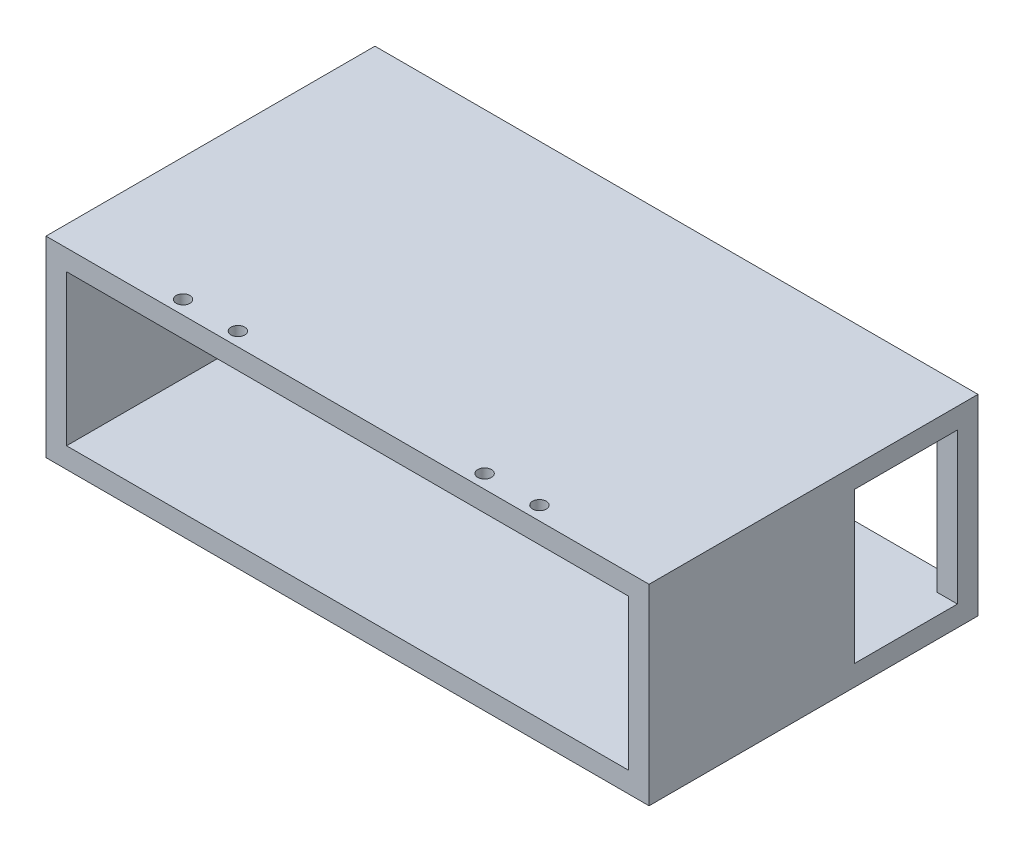
ISO-10303-21;
HEADER;
FILE_DESCRIPTION(('STEP AP214'),'2;1');
FILE_NAME('part.step','',(''),(''),'','','');
FILE_SCHEMA(('AUTOMOTIVE_DESIGN { 1 0 10303 214 1 1 1 1 }'));
ENDSEC;
DATA;
#1=APPLICATION_CONTEXT('core data for automotive mechanical design processes');
#2=APPLICATION_PROTOCOL_DEFINITION('international standard','automotive_design',2000,#1);
#3=PRODUCT_CONTEXT('',#1,'mechanical');
#4=PRODUCT('Part','Part','',(#3));
#5=PRODUCT_RELATED_PRODUCT_CATEGORY('part','',(#4));
#6=PRODUCT_DEFINITION_FORMATION('','',#4);
#7=PRODUCT_DEFINITION_CONTEXT('part definition',#1,'design');
#8=PRODUCT_DEFINITION('design','',#6,#7);
#9=PRODUCT_DEFINITION_SHAPE('','',#8);
#10=(LENGTH_UNIT() NAMED_UNIT(*) SI_UNIT(.MILLI.,.METRE.));
#11=(NAMED_UNIT(*) PLANE_ANGLE_UNIT() SI_UNIT($,.RADIAN.));
#12=(NAMED_UNIT(*) SI_UNIT($,.STERADIAN.) SOLID_ANGLE_UNIT());
#13=UNCERTAINTY_MEASURE_WITH_UNIT(LENGTH_MEASURE(1.E-05),#10,'distance_accuracy_value','');
#14=(GEOMETRIC_REPRESENTATION_CONTEXT(3) GLOBAL_UNCERTAINTY_ASSIGNED_CONTEXT((#13)) GLOBAL_UNIT_ASSIGNED_CONTEXT((#10,
#11,#12)) REPRESENTATION_CONTEXT('',''));
#15=CARTESIAN_POINT('',(0.,0.,0.));
#16=DIRECTION('',(0.,0.,1.));
#17=DIRECTION('',(1.,0.,0.));
#18=AXIS2_PLACEMENT_3D('',#15,#16,#17);
#19=CARTESIAN_POINT('',(0.,0.,3.));
#20=DIRECTION('',(0.,0.,1.));
#21=DIRECTION('',(1.,0.,0.));
#22=AXIS2_PLACEMENT_3D('',#19,#20,#21);
#23=PLANE('',#22);
#24=DIRECTION('',(0.,1.,0.));
#25=VECTOR('',#24,1.);
#26=CARTESIAN_POINT('',(-39.6748376601907,0.,3.));
#27=LINE('',#26,#25);
#28=CARTESIAN_POINT('',(-39.6748376601907,10.7153614457831,3.));
#29=VERTEX_POINT('',#28);
#30=CARTESIAN_POINT('',(-39.6748376601907,32.7153614457831,3.));
#31=VERTEX_POINT('',#30);
#32=EDGE_CURVE('E11',#29,#31,#27,.T.);
#33=ORIENTED_EDGE('',*,*,#32,.F.);
#34=DIRECTION('',(1.,0.,0.));
#35=VECTOR('',#34,1.);
#36=CARTESIAN_POINT('',(-57.6748376601907,10.7153614457831,3.));
#37=LINE('',#36,#35);
#38=CARTESIAN_POINT('',(12.3251623398093,10.7153614457831,3.));
#39=VERTEX_POINT('',#38);
#40=EDGE_CURVE('E288',#29,#39,#37,.T.);
#41=ORIENTED_EDGE('',*,*,#40,.T.);
#42=DIRECTION('',(0.,-1.,0.));
#43=VECTOR('',#42,1.);
#44=CARTESIAN_POINT('',(12.3251623398093,0.,3.));
#45=LINE('',#44,#43);
#46=CARTESIAN_POINT('',(12.3251623398093,32.7153614457831,3.));
#47=VERTEX_POINT('',#46);
#48=EDGE_CURVE('E334',#47,#39,#45,.T.);
#49=ORIENTED_EDGE('',*,*,#48,.F.);
#50=DIRECTION('',(-1.,0.,0.));
#51=VECTOR('',#50,1.);
#52=CARTESIAN_POINT('',(-57.6748376601907,32.7153614457831,3.));
#53=LINE('',#52,#51);
#54=EDGE_CURVE('E297',#47,#31,#53,.T.);
#55=ORIENTED_EDGE('',*,*,#54,.T.);
#56=EDGE_LOOP('',(#33,#41,#49,#55));
#57=FACE_BOUND('',#56,.T.);
#58=ADVANCED_FACE('F32',(#57),#23,.T.);
#59=DIRECTION('',(0.,1.,0.));
#60=VECTOR('',#59,1.);
#61=CARTESIAN_POINT('',(27.3251623398093,0.,3.));
#62=LINE('',#61,#60);
#63=CARTESIAN_POINT('',(27.3251623398093,10.7153614457831,3.));
#64=VERTEX_POINT('',#63);
#65=CARTESIAN_POINT('',(27.3251623398093,32.7153614457831,3.));
#66=VERTEX_POINT('',#65);
#67=EDGE_CURVE('E337',#64,#66,#62,.T.);
#68=ORIENTED_EDGE('',*,*,#67,.F.);
#69=CARTESIAN_POINT('',(30.3251623398093,10.7153614457832,3.));
#70=VERTEX_POINT('',#69);
#71=EDGE_CURVE('E272',#64,#70,#37,.T.);
#72=ORIENTED_EDGE('',*,*,#71,.T.);
#73=DIRECTION('',(0.,-1.,0.));
#74=VECTOR('',#73,1.);
#75=CARTESIAN_POINT('',(30.3251623398093,32.7153614457832,3.));
#76=LINE('',#75,#74);
#77=CARTESIAN_POINT('',(30.3251623398093,32.7153614457832,3.));
#78=VERTEX_POINT('',#77);
#79=EDGE_CURVE('E215',#78,#70,#76,.T.);
#80=ORIENTED_EDGE('',*,*,#79,.F.);
#81=EDGE_CURVE('E293',#78,#66,#53,.T.);
#82=ORIENTED_EDGE('',*,*,#81,.T.);
#83=EDGE_LOOP('',(#68,#72,#80,#82));
#84=FACE_BOUND('',#83,.T.);
#85=ADVANCED_FACE('F352',(#84),#23,.T.);
#86=CARTESIAN_POINT('',(-57.6748376601907,35.7153614457831,48.));
#87=DIRECTION('',(1.,0.,0.));
#88=DIRECTION('',(0.,1.,0.));
#89=AXIS2_PLACEMENT_3D('',#86,#87,#88);
#90=PLANE('',#89);
#91=DIRECTION('',(0.,0.,1.));
#92=VECTOR('',#91,1.);
#93=CARTESIAN_POINT('',(-57.6748376601907,10.7153614457831,3.));
#94=LINE('',#93,#92);
#95=CARTESIAN_POINT('',(-57.6748376601907,10.7153614457831,3.));
#96=VERTEX_POINT('',#95);
#97=CARTESIAN_POINT('',(-57.6748376601907,10.7153614457831,18.));
#98=VERTEX_POINT('',#97);
#99=EDGE_CURVE('E231',#96,#98,#94,.T.);
#100=ORIENTED_EDGE('',*,*,#99,.F.);
#101=DIRECTION('',(0.,-1.,0.));
#102=VECTOR('',#101,1.);
#103=CARTESIAN_POINT('',(-57.6748376601907,32.7153614457831,3.));
#104=LINE('',#103,#102);
#105=CARTESIAN_POINT('',(-57.6748376601907,32.7153614457831,3.));
#106=VERTEX_POINT('',#105);
#107=EDGE_CURVE('E208',#106,#96,#104,.T.);
#108=ORIENTED_EDGE('',*,*,#107,.F.);
#109=DIRECTION('',(0.,0.,-1.));
#110=VECTOR('',#109,1.);
#111=CARTESIAN_POINT('',(-57.6748376601907,32.7153614457831,3.));
#112=LINE('',#111,#110);
#113=CARTESIAN_POINT('',(-57.6748376601907,32.7153614457831,18.));
#114=VERTEX_POINT('',#113);
#115=EDGE_CURVE('E219',#114,#106,#112,.T.);
#116=ORIENTED_EDGE('',*,*,#115,.F.);
#117=DIRECTION('',(0.,1.,0.));
#118=VECTOR('',#117,1.);
#119=CARTESIAN_POINT('',(-57.6748376601907,32.7153614457831,18.));
#120=LINE('',#119,#118);
#121=EDGE_CURVE('E234',#98,#114,#120,.T.);
#122=ORIENTED_EDGE('',*,*,#121,.F.);
#123=EDGE_LOOP('',(#100,#108,#116,#122));
#124=FACE_BOUND('',#123,.T.);
#125=DIRECTION('',(0.,-1.,0.));
#126=VECTOR('',#125,1.);
#127=CARTESIAN_POINT('',(-57.6748376601907,35.7153614457831,0.));
#128=LINE('',#127,#126);
#129=CARTESIAN_POINT('',(-57.6748376601907,35.7153614457831,0.));
#130=VERTEX_POINT('',#129);
#131=CARTESIAN_POINT('',(-57.6748376601907,7.71536144578314,0.));
#132=VERTEX_POINT('',#131);
#133=EDGE_CURVE('E278',#130,#132,#128,.T.);
#134=ORIENTED_EDGE('',*,*,#133,.T.);
#135=DIRECTION('',(0.,0.,-1.));
#136=VECTOR('',#135,1.);
#137=CARTESIAN_POINT('',(-57.6748376601907,7.71536144578314,48.));
#138=LINE('',#137,#136);
#139=CARTESIAN_POINT('',(-57.6748376601907,7.71536144578314,48.));
#140=VERTEX_POINT('',#139);
#141=EDGE_CURVE('E331',#140,#132,#138,.T.);
#142=ORIENTED_EDGE('',*,*,#141,.F.);
#143=DIRECTION('',(0.,-1.,0.));
#144=VECTOR('',#143,1.);
#145=CARTESIAN_POINT('',(-57.6748376601907,35.7153614457831,48.));
#146=LINE('',#145,#144);
#147=CARTESIAN_POINT('',(-57.6748376601907,35.7153614457831,48.));
#148=VERTEX_POINT('',#147);
#149=EDGE_CURVE('E305',#148,#140,#146,.T.);
#150=ORIENTED_EDGE('',*,*,#149,.F.);
#151=DIRECTION('',(0.,0.,-1.));
#152=VECTOR('',#151,1.);
#153=CARTESIAN_POINT('',(-57.6748376601907,35.7153614457831,48.));
#154=LINE('',#153,#152);
#155=EDGE_CURVE('E315',#148,#130,#154,.T.);
#156=ORIENTED_EDGE('',*,*,#155,.T.);
#157=EDGE_LOOP('',(#134,#142,#150,#156));
#158=FACE_BOUND('',#157,.T.);
#159=ADVANCED_FACE('F34',(#124,#158),#90,.F.);
#160=CARTESIAN_POINT('',(-57.6748376601907,7.71536144578314,48.));
#161=DIRECTION('',(0.,1.,0.));
#162=DIRECTION('',(0.,0.,1.));
#163=AXIS2_PLACEMENT_3D('',#160,#161,#162);
#164=PLANE('',#163);
#165=DIRECTION('',(1.,0.,0.));
#166=VECTOR('',#165,1.);
#167=CARTESIAN_POINT('',(-57.6748376601907,7.71536144578314,0.));
#168=LINE('',#167,#166);
#169=CARTESIAN_POINT('',(30.3251623398093,7.71536144578314,0.));
#170=VERTEX_POINT('',#169);
#171=EDGE_CURVE('E318',#132,#170,#168,.T.);
#172=ORIENTED_EDGE('',*,*,#171,.T.);
#173=DIRECTION('',(0.,0.,-1.));
#174=VECTOR('',#173,1.);
#175=CARTESIAN_POINT('',(30.3251623398093,7.71536144578314,48.));
#176=LINE('',#175,#174);
#177=CARTESIAN_POINT('',(30.3251623398093,7.71536144578314,48.));
#178=VERTEX_POINT('',#177);
#179=EDGE_CURVE('E328',#178,#170,#176,.T.);
#180=ORIENTED_EDGE('',*,*,#179,.F.);
#181=DIRECTION('',(1.,0.,0.));
#182=VECTOR('',#181,1.);
#183=CARTESIAN_POINT('',(-57.6748376601907,7.71536144578314,48.));
#184=LINE('',#183,#182);
#185=EDGE_CURVE('E308',#140,#178,#184,.T.);
#186=ORIENTED_EDGE('',*,*,#185,.F.);
#187=ORIENTED_EDGE('',*,*,#141,.T.);
#188=EDGE_LOOP('',(#172,#180,#186,#187));
#189=FACE_BOUND('',#188,.T.);
#190=ADVANCED_FACE('F495',(#189),#164,.F.);
#191=CARTESIAN_POINT('',(30.3251623398093,35.7153614457831,48.));
#192=DIRECTION('',(-1.,0.,0.));
#193=DIRECTION('',(0.,-1.,0.));
#194=AXIS2_PLACEMENT_3D('',#191,#192,#193);
#195=PLANE('',#194);
#196=DIRECTION('',(0.,0.,-1.));
#197=VECTOR('',#196,1.);
#198=CARTESIAN_POINT('',(30.3251623398093,32.7153614457832,3.));
#199=LINE('',#198,#197);
#200=CARTESIAN_POINT('',(30.3251623398093,32.7153614457832,18.));
#201=VERTEX_POINT('',#200);
#202=EDGE_CURVE('E225',#201,#78,#199,.T.);
#203=ORIENTED_EDGE('',*,*,#202,.T.);
#204=ORIENTED_EDGE('',*,*,#79,.T.);
#205=DIRECTION('',(0.,0.,1.));
#206=VECTOR('',#205,1.);
#207=CARTESIAN_POINT('',(30.3251623398093,10.7153614457832,3.));
#208=LINE('',#207,#206);
#209=CARTESIAN_POINT('',(30.3251623398093,10.7153614457832,18.));
#210=VERTEX_POINT('',#209);
#211=EDGE_CURVE('E218',#70,#210,#208,.T.);
#212=ORIENTED_EDGE('',*,*,#211,.T.);
#213=DIRECTION('',(0.,1.,0.));
#214=VECTOR('',#213,1.);
#215=CARTESIAN_POINT('',(30.3251623398093,32.7153614457832,18.));
#216=LINE('',#215,#214);
#217=EDGE_CURVE('E222',#210,#201,#216,.T.);
#218=ORIENTED_EDGE('',*,*,#217,.T.);
#219=EDGE_LOOP('',(#203,#204,#212,#218));
#220=FACE_BOUND('',#219,.T.);
#221=DIRECTION('',(0.,1.,0.));
#222=VECTOR('',#221,1.);
#223=CARTESIAN_POINT('',(30.3251623398093,35.7153614457831,0.));
#224=LINE('',#223,#222);
#225=CARTESIAN_POINT('',(30.3251623398093,35.7153614457831,0.));
#226=VERTEX_POINT('',#225);
#227=EDGE_CURVE('E320',#170,#226,#224,.T.);
#228=ORIENTED_EDGE('',*,*,#227,.T.);
#229=DIRECTION('',(0.,0.,-1.));
#230=VECTOR('',#229,1.);
#231=CARTESIAN_POINT('',(30.3251623398093,35.7153614457831,48.));
#232=LINE('',#231,#230);
#233=CARTESIAN_POINT('',(30.3251623398093,35.7153614457831,48.));
#234=VERTEX_POINT('',#233);
#235=EDGE_CURVE('E325',#234,#226,#232,.T.);
#236=ORIENTED_EDGE('',*,*,#235,.F.);
#237=DIRECTION('',(0.,1.,0.));
#238=VECTOR('',#237,1.);
#239=CARTESIAN_POINT('',(30.3251623398093,35.7153614457831,48.));
#240=LINE('',#239,#238);
#241=EDGE_CURVE('E311',#178,#234,#240,.T.);
#242=ORIENTED_EDGE('',*,*,#241,.F.);
#243=ORIENTED_EDGE('',*,*,#179,.T.);
#244=EDGE_LOOP('',(#228,#236,#242,#243));
#245=FACE_BOUND('',#244,.T.);
#246=ADVANCED_FACE('F355',(#220,#245),#195,.F.);
#247=CARTESIAN_POINT('',(-57.6748376601907,35.7153614457831,48.));
#248=DIRECTION('',(0.,-1.,0.));
#249=DIRECTION('',(0.,0.,-1.));
#250=AXIS2_PLACEMENT_3D('',#247,#248,#249);
#251=PLANE('',#250);
#252=CARTESIAN_POINT('',(-39.6748376601907,35.7153614457831,46.));
#253=DIRECTION('',(0.,1.,0.));
#254=DIRECTION('',(0.,0.,1.));
#255=AXIS2_PLACEMENT_3D('',#252,#253,#254);
#256=CIRCLE('',#255,0.999999999999998);
#257=CARTESIAN_POINT('',(-39.6748376601907,35.7153614457831,47.));
#258=VERTEX_POINT('',#257);
#259=EDGE_CURVE('E255',#258,#258,#256,.T.);
#260=ORIENTED_EDGE('',*,*,#259,.F.);
#261=EDGE_LOOP('',(#260));
#262=FACE_BOUND('',#261,.T.);
#263=CARTESIAN_POINT('',(12.3251623398093,35.7153614457831,46.));
#264=DIRECTION('',(0.,1.,0.));
#265=DIRECTION('',(0.,0.,-1.));
#266=AXIS2_PLACEMENT_3D('',#263,#264,#265);
#267=CIRCLE('',#266,0.999999999999998);
#268=CARTESIAN_POINT('',(12.3251623398093,35.7153614457831,45.));
#269=VERTEX_POINT('',#268);
#270=EDGE_CURVE('E261',#269,#269,#267,.T.);
#271=ORIENTED_EDGE('',*,*,#270,.F.);
#272=EDGE_LOOP('',(#271));
#273=FACE_BOUND('',#272,.T.);
#274=CARTESIAN_POINT('',(4.32516233980931,35.7153614457831,46.));
#275=DIRECTION('',(0.,1.,0.));
#276=DIRECTION('',(0.,0.,-1.));
#277=AXIS2_PLACEMENT_3D('',#274,#275,#276);
#278=CIRCLE('',#277,1.);
#279=CARTESIAN_POINT('',(4.32516233980931,35.7153614457831,45.));
#280=VERTEX_POINT('',#279);
#281=EDGE_CURVE('E250',#280,#280,#278,.T.);
#282=ORIENTED_EDGE('',*,*,#281,.F.);
#283=EDGE_LOOP('',(#282));
#284=FACE_BOUND('',#283,.T.);
#285=CARTESIAN_POINT('',(-31.6748376601907,35.7153614457831,46.));
#286=DIRECTION('',(0.,1.,0.));
#287=DIRECTION('',(0.,0.,1.));
#288=AXIS2_PLACEMENT_3D('',#285,#286,#287);
#289=CIRCLE('',#288,1.);
#290=CARTESIAN_POINT('',(-31.6748376601907,35.7153614457831,47.));
#291=VERTEX_POINT('',#290);
#292=EDGE_CURVE('E254',#291,#291,#289,.T.);
#293=ORIENTED_EDGE('',*,*,#292,.F.);
#294=EDGE_LOOP('',(#293));
#295=FACE_BOUND('',#294,.T.);
#296=DIRECTION('',(-1.,0.,0.));
#297=VECTOR('',#296,1.);
#298=CARTESIAN_POINT('',(-57.6748376601907,35.7153614457831,0.));
#299=LINE('',#298,#297);
#300=EDGE_CURVE('E309',#226,#130,#299,.T.);
#301=ORIENTED_EDGE('',*,*,#300,.T.);
#302=ORIENTED_EDGE('',*,*,#155,.F.);
#303=DIRECTION('',(-1.,0.,0.));
#304=VECTOR('',#303,1.);
#305=CARTESIAN_POINT('',(-57.6748376601907,35.7153614457831,48.));
#306=LINE('',#305,#304);
#307=EDGE_CURVE('E313',#234,#148,#306,.T.);
#308=ORIENTED_EDGE('',*,*,#307,.F.);
#309=ORIENTED_EDGE('',*,*,#235,.T.);
#310=EDGE_LOOP('',(#301,#302,#308,#309));
#311=FACE_BOUND('',#310,.T.);
#312=ADVANCED_FACE('F474',(#262,#273,#284,#295,#311),#251,.F.);
#313=CARTESIAN_POINT('',(0.,0.,48.));
#314=DIRECTION('',(0.,0.,1.));
#315=DIRECTION('',(1.,0.,0.));
#316=AXIS2_PLACEMENT_3D('',#313,#314,#315);
#317=PLANE('',#316);
#318=DIRECTION('',(0.,-1.,0.));
#319=VECTOR('',#318,1.);
#320=CARTESIAN_POINT('',(-54.6748376601907,35.7153614457831,48.));
#321=LINE('',#320,#319);
#322=CARTESIAN_POINT('',(-54.6748376601907,32.7153614457831,48.));
#323=VERTEX_POINT('',#322);
#324=CARTESIAN_POINT('',(-54.6748376601907,10.7153614457831,48.));
#325=VERTEX_POINT('',#324);
#326=EDGE_CURVE('E296',#323,#325,#321,.T.);
#327=ORIENTED_EDGE('',*,*,#326,.F.);
#328=DIRECTION('',(-1.,0.,0.));
#329=VECTOR('',#328,1.);
#330=CARTESIAN_POINT('',(-57.6748376601907,32.7153614457831,48.));
#331=LINE('',#330,#329);
#332=CARTESIAN_POINT('',(27.3251623398093,32.7153614457831,48.));
#333=VERTEX_POINT('',#332);
#334=EDGE_CURVE('E284',#333,#323,#331,.T.);
#335=ORIENTED_EDGE('',*,*,#334,.F.);
#336=DIRECTION('',(0.,1.,0.));
#337=VECTOR('',#336,1.);
#338=CARTESIAN_POINT('',(27.3251623398093,35.7153614457831,48.));
#339=LINE('',#338,#337);
#340=CARTESIAN_POINT('',(27.3251623398093,10.7153614457831,48.));
#341=VERTEX_POINT('',#340);
#342=EDGE_CURVE('E301',#341,#333,#339,.T.);
#343=ORIENTED_EDGE('',*,*,#342,.F.);
#344=DIRECTION('',(1.,0.,0.));
#345=VECTOR('',#344,1.);
#346=CARTESIAN_POINT('',(-57.6748376601907,10.7153614457831,48.));
#347=LINE('',#346,#345);
#348=EDGE_CURVE('E299',#325,#341,#347,.T.);
#349=ORIENTED_EDGE('',*,*,#348,.F.);
#350=EDGE_LOOP('',(#327,#335,#343,#349));
#351=FACE_BOUND('',#350,.T.);
#352=ORIENTED_EDGE('',*,*,#149,.T.);
#353=ORIENTED_EDGE('',*,*,#185,.T.);
#354=ORIENTED_EDGE('',*,*,#241,.T.);
#355=ORIENTED_EDGE('',*,*,#307,.T.);
#356=EDGE_LOOP('',(#352,#353,#354,#355));
#357=FACE_BOUND('',#356,.T.);
#358=ADVANCED_FACE('F367',(#351,#357),#317,.T.);
#359=CARTESIAN_POINT('',(0.,0.,0.));
#360=DIRECTION('',(0.,0.,1.));
#361=DIRECTION('',(1.,0.,0.));
#362=AXIS2_PLACEMENT_3D('',#359,#360,#361);
#363=PLANE('',#362);
#364=DIRECTION('',(-1.,0.,0.));
#365=VECTOR('',#364,1.);
#366=CARTESIAN_POINT('',(-39.6748376601907,10.7153614457831,0.));
#367=LINE('',#366,#365);
#368=CARTESIAN_POINT('',(-39.6748376601907,10.7153614457831,0.));
#369=VERTEX_POINT('',#368);
#370=CARTESIAN_POINT('',(-54.6748376601907,10.7153614457831,0.));
#371=VERTEX_POINT('',#370);
#372=EDGE_CURVE('E177',#369,#371,#367,.T.);
#373=ORIENTED_EDGE('',*,*,#372,.F.);
#374=DIRECTION('',(0.,-1.,0.));
#375=VECTOR('',#374,1.);
#376=CARTESIAN_POINT('',(-39.6748376601907,32.7153614457831,0.));
#377=LINE('',#376,#375);
#378=CARTESIAN_POINT('',(-39.6748376601907,32.7153614457831,0.));
#379=VERTEX_POINT('',#378);
#380=EDGE_CURVE('E47',#379,#369,#377,.T.);
#381=ORIENTED_EDGE('',*,*,#380,.F.);
#382=DIRECTION('',(1.,0.,0.));
#383=VECTOR('',#382,1.);
#384=CARTESIAN_POINT('',(-39.6748376601907,32.7153614457831,0.));
#385=LINE('',#384,#383);
#386=CARTESIAN_POINT('',(-54.6748376601907,32.7153614457831,0.));
#387=VERTEX_POINT('',#386);
#388=EDGE_CURVE('E185',#387,#379,#385,.T.);
#389=ORIENTED_EDGE('',*,*,#388,.F.);
#390=DIRECTION('',(0.,1.,0.));
#391=VECTOR('',#390,1.);
#392=CARTESIAN_POINT('',(-54.6748376601907,32.7153614457831,0.));
#393=LINE('',#392,#391);
#394=EDGE_CURVE('E169',#371,#387,#393,.T.);
#395=ORIENTED_EDGE('',*,*,#394,.F.);
#396=EDGE_LOOP('',(#373,#381,#389,#395));
#397=FACE_BOUND('',#396,.T.);
#398=DIRECTION('',(-1.,0.,0.));
#399=VECTOR('',#398,1.);
#400=CARTESIAN_POINT('',(27.3251623398093,10.7153614457831,0.));
#401=LINE('',#400,#399);
#402=CARTESIAN_POINT('',(27.3251623398093,10.7153614457831,0.));
#403=VERTEX_POINT('',#402);
#404=CARTESIAN_POINT('',(12.3251623398093,10.7153614457831,0.));
#405=VERTEX_POINT('',#404);
#406=EDGE_CURVE('E196',#403,#405,#401,.T.);
#407=ORIENTED_EDGE('',*,*,#406,.F.);
#408=DIRECTION('',(0.,-1.,0.));
#409=VECTOR('',#408,1.);
#410=CARTESIAN_POINT('',(27.3251623398093,32.7153614457831,0.));
#411=LINE('',#410,#409);
#412=CARTESIAN_POINT('',(27.3251623398093,32.7153614457831,0.));
#413=VERTEX_POINT('',#412);
#414=EDGE_CURVE('E192',#413,#403,#411,.T.);
#415=ORIENTED_EDGE('',*,*,#414,.F.);
#416=DIRECTION('',(1.,0.,0.));
#417=VECTOR('',#416,1.);
#418=CARTESIAN_POINT('',(27.3251623398093,32.7153614457831,0.));
#419=LINE('',#418,#417);
#420=CARTESIAN_POINT('',(12.3251623398093,32.7153614457831,0.));
#421=VERTEX_POINT('',#420);
#422=EDGE_CURVE('E202',#421,#413,#419,.T.);
#423=ORIENTED_EDGE('',*,*,#422,.F.);
#424=DIRECTION('',(0.,1.,0.));
#425=VECTOR('',#424,1.);
#426=CARTESIAN_POINT('',(12.3251623398093,32.7153614457831,0.));
#427=LINE('',#426,#425);
#428=EDGE_CURVE('E199',#405,#421,#427,.T.);
#429=ORIENTED_EDGE('',*,*,#428,.F.);
#430=EDGE_LOOP('',(#407,#415,#423,#429));
#431=FACE_BOUND('',#430,.T.);
#432=ORIENTED_EDGE('',*,*,#133,.F.);
#433=ORIENTED_EDGE('',*,*,#300,.F.);
#434=ORIENTED_EDGE('',*,*,#227,.F.);
#435=ORIENTED_EDGE('',*,*,#171,.F.);
#436=EDGE_LOOP('',(#432,#433,#434,#435));
#437=FACE_BOUND('',#436,.T.);
#438=ADVANCED_FACE('F182',(#397,#431,#437),#363,.F.);
#439=CARTESIAN_POINT('',(-54.6748376601907,35.7153614457831,48.));
#440=DIRECTION('',(1.,0.,0.));
#441=DIRECTION('',(0.,1.,0.));
#442=AXIS2_PLACEMENT_3D('',#439,#440,#441);
#443=PLANE('',#442);
#444=DIRECTION('',(0.,-1.,0.));
#445=VECTOR('',#444,1.);
#446=CARTESIAN_POINT('',(-54.6748376601907,35.7153614457831,18.));
#447=LINE('',#446,#445);
#448=CARTESIAN_POINT('',(-54.6748376601907,32.7153614457831,18.));
#449=VERTEX_POINT('',#448);
#450=CARTESIAN_POINT('',(-54.6748376601907,10.7153614457831,18.));
#451=VERTEX_POINT('',#450);
#452=EDGE_CURVE('E247',#449,#451,#447,.T.);
#453=ORIENTED_EDGE('',*,*,#452,.F.);
#454=DIRECTION('',(0.,0.,-1.));
#455=VECTOR('',#454,1.);
#456=CARTESIAN_POINT('',(-54.6748376601907,32.7153614457831,48.));
#457=LINE('',#456,#455);
#458=EDGE_CURVE('E280',#323,#449,#457,.T.);
#459=ORIENTED_EDGE('',*,*,#458,.F.);
#460=ORIENTED_EDGE('',*,*,#326,.T.);
#461=DIRECTION('',(0.,0.,-1.));
#462=VECTOR('',#461,1.);
#463=CARTESIAN_POINT('',(-54.6748376601907,10.7153614457831,48.));
#464=LINE('',#463,#462);
#465=EDGE_CURVE('E275',#325,#451,#464,.T.);
#466=ORIENTED_EDGE('',*,*,#465,.T.);
#467=EDGE_LOOP('',(#453,#459,#460,#466));
#468=FACE_BOUND('',#467,.T.);
#469=ADVANCED_FACE('F372',(#468),#443,.T.);
#470=CARTESIAN_POINT('',(-57.6748376601907,10.7153614457831,48.));
#471=DIRECTION('',(0.,1.,0.));
#472=DIRECTION('',(0.,0.,1.));
#473=AXIS2_PLACEMENT_3D('',#470,#471,#472);
#474=PLANE('',#473);
#475=ORIENTED_EDGE('',*,*,#40,.F.);
#476=DIRECTION('',(0.,0.,-1.));
#477=VECTOR('',#476,1.);
#478=CARTESIAN_POINT('',(-39.6748376601907,10.7153614457831,15.));
#479=LINE('',#478,#477);
#480=EDGE_CURVE('E174',#29,#369,#479,.T.);
#481=ORIENTED_EDGE('',*,*,#480,.T.);
#482=ORIENTED_EDGE('',*,*,#372,.T.);
#483=DIRECTION('',(0.,0.,-1.));
#484=VECTOR('',#483,1.);
#485=CARTESIAN_POINT('',(-54.6748376601907,10.7153614457831,15.));
#486=LINE('',#485,#484);
#487=CARTESIAN_POINT('',(-54.6748376601907,10.7153614457831,3.));
#488=VERTEX_POINT('',#487);
#489=EDGE_CURVE('E55',#488,#371,#486,.T.);
#490=ORIENTED_EDGE('',*,*,#489,.F.);
#491=EDGE_CURVE('E285',#96,#488,#37,.T.);
#492=ORIENTED_EDGE('',*,*,#491,.F.);
#493=ORIENTED_EDGE('',*,*,#99,.T.);
#494=DIRECTION('',(-1.,0.,0.));
#495=VECTOR('',#494,1.);
#496=CARTESIAN_POINT('',(30.3251623398093,10.7153614457832,18.));
#497=LINE('',#496,#495);
#498=EDGE_CURVE('E228',#451,#98,#497,.T.);
#499=ORIENTED_EDGE('',*,*,#498,.F.);
#500=ORIENTED_EDGE('',*,*,#465,.F.);
#501=ORIENTED_EDGE('',*,*,#348,.T.);
#502=DIRECTION('',(0.,0.,-1.));
#503=VECTOR('',#502,1.);
#504=CARTESIAN_POINT('',(27.3251623398093,10.7153614457831,48.));
#505=LINE('',#504,#503);
#506=CARTESIAN_POINT('',(27.3251623398093,10.7153614457832,18.));
#507=VERTEX_POINT('',#506);
#508=EDGE_CURVE('E279',#341,#507,#505,.T.);
#509=ORIENTED_EDGE('',*,*,#508,.T.);
#510=EDGE_CURVE('E244',#210,#507,#497,.T.);
#511=ORIENTED_EDGE('',*,*,#510,.F.);
#512=ORIENTED_EDGE('',*,*,#211,.F.);
#513=ORIENTED_EDGE('',*,*,#71,.F.);
#514=DIRECTION('',(0.,0.,-1.));
#515=VECTOR('',#514,1.);
#516=CARTESIAN_POINT('',(27.3251623398093,10.7153614457831,15.));
#517=LINE('',#516,#515);
#518=EDGE_CURVE('E205',#64,#403,#517,.T.);
#519=ORIENTED_EDGE('',*,*,#518,.T.);
#520=ORIENTED_EDGE('',*,*,#406,.T.);
#521=DIRECTION('',(0.,0.,-1.));
#522=VECTOR('',#521,1.);
#523=CARTESIAN_POINT('',(12.3251623398093,10.7153614457831,15.));
#524=LINE('',#523,#522);
#525=EDGE_CURVE('E211',#39,#405,#524,.T.);
#526=ORIENTED_EDGE('',*,*,#525,.F.);
#527=EDGE_LOOP('',(#475,#481,#482,#490,#492,#493,#499,#500,#501,#509,#511,#512,#513,#519,#520,#526));
#528=FACE_BOUND('',#527,.T.);
#529=ADVANCED_FACE('F179',(#528),#474,.T.);
#530=CARTESIAN_POINT('',(27.3251623398093,35.7153614457831,48.));
#531=DIRECTION('',(-1.,0.,0.));
#532=DIRECTION('',(0.,-1.,0.));
#533=AXIS2_PLACEMENT_3D('',#530,#531,#532);
#534=PLANE('',#533);
#535=DIRECTION('',(0.,1.,0.));
#536=VECTOR('',#535,1.);
#537=CARTESIAN_POINT('',(27.3251623398093,35.7153614457831,18.));
#538=LINE('',#537,#536);
#539=CARTESIAN_POINT('',(27.3251623398093,32.7153614457832,18.));
#540=VERTEX_POINT('',#539);
#541=EDGE_CURVE('E242',#507,#540,#538,.T.);
#542=ORIENTED_EDGE('',*,*,#541,.F.);
#543=ORIENTED_EDGE('',*,*,#508,.F.);
#544=ORIENTED_EDGE('',*,*,#342,.T.);
#545=DIRECTION('',(0.,0.,-1.));
#546=VECTOR('',#545,1.);
#547=CARTESIAN_POINT('',(27.3251623398093,32.7153614457831,48.));
#548=LINE('',#547,#546);
#549=EDGE_CURVE('E283',#333,#540,#548,.T.);
#550=ORIENTED_EDGE('',*,*,#549,.T.);
#551=EDGE_LOOP('',(#542,#543,#544,#550));
#552=FACE_BOUND('',#551,.T.);
#553=ADVANCED_FACE('F360',(#552),#534,.T.);
#554=CARTESIAN_POINT('',(-57.6748376601907,32.7153614457831,48.));
#555=DIRECTION('',(0.,-1.,0.));
#556=DIRECTION('',(0.,0.,-1.));
#557=AXIS2_PLACEMENT_3D('',#554,#555,#556);
#558=PLANE('',#557);
#559=CARTESIAN_POINT('',(-54.6748376601907,32.7153614457831,3.));
#560=VERTEX_POINT('',#559);
#561=EDGE_CURVE('E287',#560,#106,#53,.T.);
#562=ORIENTED_EDGE('',*,*,#561,.F.);
#563=DIRECTION('',(0.,0.,-1.));
#564=VECTOR('',#563,1.);
#565=CARTESIAN_POINT('',(-54.6748376601907,32.7153614457831,15.));
#566=LINE('',#565,#564);
#567=EDGE_CURVE('E173',#560,#387,#566,.T.);
#568=ORIENTED_EDGE('',*,*,#567,.T.);
#569=ORIENTED_EDGE('',*,*,#388,.T.);
#570=DIRECTION('',(0.,0.,-1.));
#571=VECTOR('',#570,1.);
#572=CARTESIAN_POINT('',(-39.6748376601907,32.7153614457831,15.));
#573=LINE('',#572,#571);
#574=EDGE_CURVE('E190',#31,#379,#573,.T.);
#575=ORIENTED_EDGE('',*,*,#574,.F.);
#576=ORIENTED_EDGE('',*,*,#54,.F.);
#577=DIRECTION('',(0.,0.,-1.));
#578=VECTOR('',#577,1.);
#579=CARTESIAN_POINT('',(12.3251623398093,32.7153614457831,15.));
#580=LINE('',#579,#578);
#581=EDGE_CURVE('E209',#47,#421,#580,.T.);
#582=ORIENTED_EDGE('',*,*,#581,.T.);
#583=ORIENTED_EDGE('',*,*,#422,.T.);
#584=DIRECTION('',(0.,0.,-1.));
#585=VECTOR('',#584,1.);
#586=CARTESIAN_POINT('',(27.3251623398093,32.7153614457831,15.));
#587=LINE('',#586,#585);
#588=EDGE_CURVE('E206',#66,#413,#587,.T.);
#589=ORIENTED_EDGE('',*,*,#588,.F.);
#590=ORIENTED_EDGE('',*,*,#81,.F.);
#591=ORIENTED_EDGE('',*,*,#202,.F.);
#592=DIRECTION('',(-1.,0.,0.));
#593=VECTOR('',#592,1.);
#594=CARTESIAN_POINT('',(30.3251623398093,32.7153614457832,18.));
#595=LINE('',#594,#593);
#596=EDGE_CURVE('E239',#201,#540,#595,.T.);
#597=ORIENTED_EDGE('',*,*,#596,.T.);
#598=ORIENTED_EDGE('',*,*,#549,.F.);
#599=ORIENTED_EDGE('',*,*,#334,.T.);
#600=ORIENTED_EDGE('',*,*,#458,.T.);
#601=EDGE_CURVE('E243',#449,#114,#595,.T.);
#602=ORIENTED_EDGE('',*,*,#601,.T.);
#603=ORIENTED_EDGE('',*,*,#115,.T.);
#604=EDGE_LOOP('',(#562,#568,#569,#575,#576,#582,#583,#589,#590,#591,#597,#598,#599,#600,#602,#603));
#605=FACE_BOUND('',#604,.T.);
#606=CARTESIAN_POINT('',(-39.6748376601907,32.7153614457831,46.));
#607=DIRECTION('',(0.,1.,0.));
#608=DIRECTION('',(0.,0.,1.));
#609=AXIS2_PLACEMENT_3D('',#606,#607,#608);
#610=CIRCLE('',#609,0.999999999999998);
#611=CARTESIAN_POINT('',(-39.6748376601907,32.7153614457831,47.));
#612=VERTEX_POINT('',#611);
#613=EDGE_CURVE('E251',#612,#612,#610,.T.);
#614=ORIENTED_EDGE('',*,*,#613,.T.);
#615=EDGE_LOOP('',(#614));
#616=FACE_BOUND('',#615,.T.);
#617=CARTESIAN_POINT('',(12.3251623398093,32.7153614457831,46.));
#618=DIRECTION('',(0.,1.,0.));
#619=DIRECTION('',(0.,0.,-1.));
#620=AXIS2_PLACEMENT_3D('',#617,#618,#619);
#621=CIRCLE('',#620,0.999999999999998);
#622=CARTESIAN_POINT('',(12.3251623398093,32.7153614457831,45.));
#623=VERTEX_POINT('',#622);
#624=EDGE_CURVE('E258',#623,#623,#621,.T.);
#625=ORIENTED_EDGE('',*,*,#624,.T.);
#626=EDGE_LOOP('',(#625));
#627=FACE_BOUND('',#626,.T.);
#628=CARTESIAN_POINT('',(4.32516233980931,32.7153614457831,46.));
#629=DIRECTION('',(0.,1.,0.));
#630=DIRECTION('',(0.,0.,-1.));
#631=AXIS2_PLACEMENT_3D('',#628,#629,#630);
#632=CIRCLE('',#631,1.);
#633=CARTESIAN_POINT('',(4.32516233980931,32.7153614457831,45.));
#634=VERTEX_POINT('',#633);
#635=EDGE_CURVE('E264',#634,#634,#632,.T.);
#636=ORIENTED_EDGE('',*,*,#635,.T.);
#637=EDGE_LOOP('',(#636));
#638=FACE_BOUND('',#637,.T.);
#639=CARTESIAN_POINT('',(-31.6748376601907,32.7153614457831,46.));
#640=DIRECTION('',(0.,1.,0.));
#641=DIRECTION('',(0.,0.,1.));
#642=AXIS2_PLACEMENT_3D('',#639,#640,#641);
#643=CIRCLE('',#642,1.);
#644=CARTESIAN_POINT('',(-31.6748376601907,32.7153614457831,47.));
#645=VERTEX_POINT('',#644);
#646=EDGE_CURVE('E269',#645,#645,#643,.T.);
#647=ORIENTED_EDGE('',*,*,#646,.T.);
#648=EDGE_LOOP('',(#647));
#649=FACE_BOUND('',#648,.T.);
#650=ADVANCED_FACE('F346',(#605,#616,#627,#638,#649),#558,.T.);
#651=DIRECTION('',(0.,-1.,0.));
#652=VECTOR('',#651,1.);
#653=CARTESIAN_POINT('',(-54.6748376601907,0.,3.));
#654=LINE('',#653,#652);
#655=EDGE_CURVE('E40',#560,#488,#654,.T.);
#656=ORIENTED_EDGE('',*,*,#655,.F.);
#657=ORIENTED_EDGE('',*,*,#561,.T.);
#658=ORIENTED_EDGE('',*,*,#107,.T.);
#659=ORIENTED_EDGE('',*,*,#491,.T.);
#660=EDGE_LOOP('',(#656,#657,#658,#659));
#661=FACE_BOUND('',#660,.T.);
#662=ADVANCED_FACE('F383',(#661),#23,.T.);
#663=CARTESIAN_POINT('',(-31.6748376601907,32.7153614457831,46.));
#664=DIRECTION('',(0.,1.,0.));
#665=DIRECTION('',(0.,0.,1.));
#666=AXIS2_PLACEMENT_3D('',#663,#664,#665);
#667=CYLINDRICAL_SURFACE('',#666,1.);
#668=ORIENTED_EDGE('',*,*,#646,.F.);
#669=EDGE_LOOP('',(#668));
#670=FACE_BOUND('',#669,.T.);
#671=ORIENTED_EDGE('',*,*,#292,.T.);
#672=EDGE_LOOP('',(#671));
#673=FACE_BOUND('',#672,.T.);
#674=ADVANCED_FACE('F409',(#670,#673),#667,.F.);
#675=CARTESIAN_POINT('',(4.32516233980931,32.7153614457831,46.));
#676=DIRECTION('',(0.,1.,0.));
#677=DIRECTION('',(0.,0.,1.));
#678=AXIS2_PLACEMENT_3D('',#675,#676,#677);
#679=CYLINDRICAL_SURFACE('',#678,1.);
#680=ORIENTED_EDGE('',*,*,#635,.F.);
#681=EDGE_LOOP('',(#680));
#682=FACE_BOUND('',#681,.T.);
#683=ORIENTED_EDGE('',*,*,#281,.T.);
#684=EDGE_LOOP('',(#683));
#685=FACE_BOUND('',#684,.T.);
#686=ADVANCED_FACE('F414',(#682,#685),#679,.F.);
#687=CARTESIAN_POINT('',(12.3251623398093,32.7153614457831,46.));
#688=DIRECTION('',(0.,1.,0.));
#689=DIRECTION('',(0.,0.,1.));
#690=AXIS2_PLACEMENT_3D('',#687,#688,#689);
#691=CYLINDRICAL_SURFACE('',#690,0.999999999999998);
#692=ORIENTED_EDGE('',*,*,#624,.F.);
#693=EDGE_LOOP('',(#692));
#694=FACE_BOUND('',#693,.T.);
#695=ORIENTED_EDGE('',*,*,#270,.T.);
#696=EDGE_LOOP('',(#695));
#697=FACE_BOUND('',#696,.T.);
#698=ADVANCED_FACE('F428',(#694,#697),#691,.F.);
#699=CARTESIAN_POINT('',(-39.6748376601907,32.7153614457831,46.));
#700=DIRECTION('',(0.,1.,0.));
#701=DIRECTION('',(0.,0.,1.));
#702=AXIS2_PLACEMENT_3D('',#699,#700,#701);
#703=CYLINDRICAL_SURFACE('',#702,0.999999999999998);
#704=ORIENTED_EDGE('',*,*,#613,.F.);
#705=EDGE_LOOP('',(#704));
#706=FACE_BOUND('',#705,.T.);
#707=ORIENTED_EDGE('',*,*,#259,.T.);
#708=EDGE_LOOP('',(#707));
#709=FACE_BOUND('',#708,.T.);
#710=ADVANCED_FACE('F432',(#706,#709),#703,.F.);
#711=CARTESIAN_POINT('',(30.3251623398093,32.7153614457832,18.));
#712=DIRECTION('',(0.,0.,1.));
#713=DIRECTION('',(0.,-1.,0.));
#714=AXIS2_PLACEMENT_3D('',#711,#712,#713);
#715=PLANE('',#714);
#716=ORIENTED_EDGE('',*,*,#541,.T.);
#717=ORIENTED_EDGE('',*,*,#596,.F.);
#718=ORIENTED_EDGE('',*,*,#217,.F.);
#719=ORIENTED_EDGE('',*,*,#510,.T.);
#720=EDGE_LOOP('',(#716,#717,#718,#719));
#721=FACE_BOUND('',#720,.T.);
#722=ADVANCED_FACE('F436',(#721),#715,.F.);
#723=ORIENTED_EDGE('',*,*,#452,.T.);
#724=ORIENTED_EDGE('',*,*,#498,.T.);
#725=ORIENTED_EDGE('',*,*,#121,.T.);
#726=ORIENTED_EDGE('',*,*,#601,.F.);
#727=EDGE_LOOP('',(#723,#724,#725,#726));
#728=FACE_BOUND('',#727,.T.);
#729=ADVANCED_FACE('F375',(#728),#715,.F.);
#730=CARTESIAN_POINT('',(27.3251623398093,32.7153614457831,15.));
#731=DIRECTION('',(1.,0.,0.));
#732=DIRECTION('',(0.,1.,0.));
#733=AXIS2_PLACEMENT_3D('',#730,#731,#732);
#734=PLANE('',#733);
#735=ORIENTED_EDGE('',*,*,#67,.T.);
#736=ORIENTED_EDGE('',*,*,#588,.T.);
#737=ORIENTED_EDGE('',*,*,#414,.T.);
#738=ORIENTED_EDGE('',*,*,#518,.F.);
#739=EDGE_LOOP('',(#735,#736,#737,#738));
#740=FACE_BOUND('',#739,.T.);
#741=ADVANCED_FACE('F341',(#740),#734,.F.);
#742=CARTESIAN_POINT('',(12.3251623398093,32.7153614457831,15.));
#743=DIRECTION('',(-1.,0.,0.));
#744=DIRECTION('',(0.,-1.,0.));
#745=AXIS2_PLACEMENT_3D('',#742,#743,#744);
#746=PLANE('',#745);
#747=ORIENTED_EDGE('',*,*,#48,.T.);
#748=ORIENTED_EDGE('',*,*,#525,.T.);
#749=ORIENTED_EDGE('',*,*,#428,.T.);
#750=ORIENTED_EDGE('',*,*,#581,.F.);
#751=EDGE_LOOP('',(#747,#748,#749,#750));
#752=FACE_BOUND('',#751,.T.);
#753=ADVANCED_FACE('F392',(#752),#746,.F.);
#754=CARTESIAN_POINT('',(-39.6748376601907,32.7153614457831,15.));
#755=DIRECTION('',(1.,0.,0.));
#756=DIRECTION('',(0.,0.,-1.));
#757=AXIS2_PLACEMENT_3D('',#754,#755,#756);
#758=PLANE('',#757);
#759=ORIENTED_EDGE('',*,*,#32,.T.);
#760=ORIENTED_EDGE('',*,*,#574,.T.);
#761=ORIENTED_EDGE('',*,*,#380,.T.);
#762=ORIENTED_EDGE('',*,*,#480,.F.);
#763=EDGE_LOOP('',(#759,#760,#761,#762));
#764=FACE_BOUND('',#763,.T.);
#765=ADVANCED_FACE('F390',(#764),#758,.F.);
#766=CARTESIAN_POINT('',(-54.6748376601907,32.7153614457831,15.));
#767=DIRECTION('',(-1.,0.,0.));
#768=DIRECTION('',(0.,0.,1.));
#769=AXIS2_PLACEMENT_3D('',#766,#767,#768);
#770=PLANE('',#769);
#771=ORIENTED_EDGE('',*,*,#655,.T.);
#772=ORIENTED_EDGE('',*,*,#489,.T.);
#773=ORIENTED_EDGE('',*,*,#394,.T.);
#774=ORIENTED_EDGE('',*,*,#567,.F.);
#775=EDGE_LOOP('',(#771,#772,#773,#774));
#776=FACE_BOUND('',#775,.T.);
#777=ADVANCED_FACE('F167',(#776),#770,.F.);
#778=CLOSED_SHELL('',(#58,#85,#159,#190,#246,#312,#358,#438,#469,#529,#553,#650,#662,#674,#686,
#698,#710,#722,#729,#741,#753,#765,#777));
#779=MANIFOLD_SOLID_BREP('B2',#778);
#780=ADVANCED_BREP_SHAPE_REPRESENTATION('',(#18,#779),#14);
#781=SHAPE_DEFINITION_REPRESENTATION(#9,#780);
ENDSEC;
END-ISO-10303-21;
